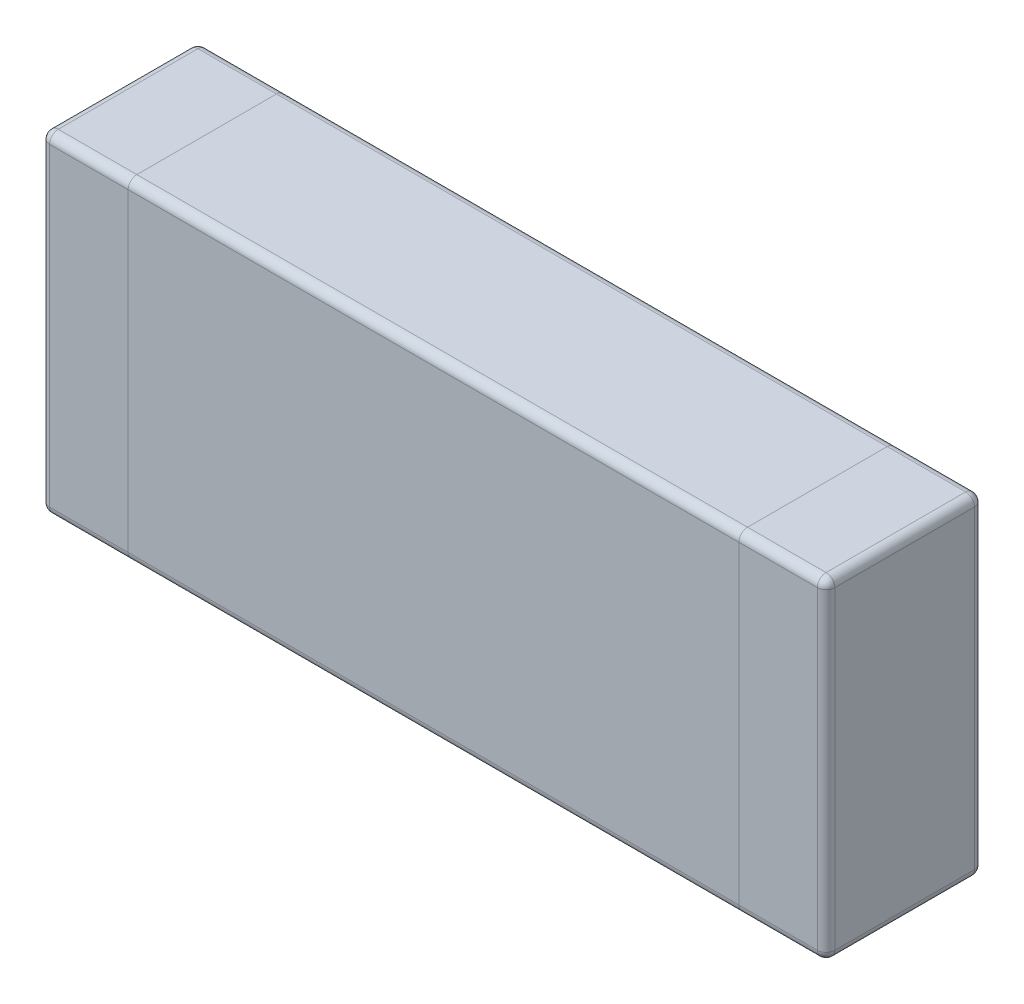
ISO-10303-21;
HEADER;
FILE_DESCRIPTION(('STEP AP214'),'2;1');
FILE_NAME('part.step','',(''),(''),'','','');
FILE_SCHEMA(('AUTOMOTIVE_DESIGN { 1 0 10303 214 1 1 1 1 }'));
ENDSEC;
DATA;
#1=APPLICATION_CONTEXT('core data for automotive mechanical design processes');
#2=APPLICATION_PROTOCOL_DEFINITION('international standard','automotive_design',2000,#1);
#3=PRODUCT_CONTEXT('',#1,'mechanical');
#4=PRODUCT('Part','Part','',(#3));
#5=PRODUCT_RELATED_PRODUCT_CATEGORY('part','',(#4));
#6=PRODUCT_DEFINITION_FORMATION('','',#4);
#7=PRODUCT_DEFINITION_CONTEXT('part definition',#1,'design');
#8=PRODUCT_DEFINITION('design','',#6,#7);
#9=PRODUCT_DEFINITION_SHAPE('','',#8);
#10=(LENGTH_UNIT() NAMED_UNIT(*) SI_UNIT(.MILLI.,.METRE.));
#11=(NAMED_UNIT(*) PLANE_ANGLE_UNIT() SI_UNIT($,.RADIAN.));
#12=(NAMED_UNIT(*) SI_UNIT($,.STERADIAN.) SOLID_ANGLE_UNIT());
#13=UNCERTAINTY_MEASURE_WITH_UNIT(LENGTH_MEASURE(1.E-05),#10,'distance_accuracy_value','');
#14=(GEOMETRIC_REPRESENTATION_CONTEXT(3) GLOBAL_UNCERTAINTY_ASSIGNED_CONTEXT((#13)) GLOBAL_UNIT_ASSIGNED_CONTEXT((#10,
#11,#12)) REPRESENTATION_CONTEXT('',''));
#15=CARTESIAN_POINT('',(0.,0.,0.));
#16=DIRECTION('',(0.,0.,1.));
#17=DIRECTION('',(1.,0.,0.));
#18=AXIS2_PLACEMENT_3D('',#15,#16,#17);
#19=CARTESIAN_POINT('',(2.25,1.9,-0.45));
#20=DIRECTION('',(0.,-1.,0.));
#21=DIRECTION('',(0.,0.,-1.));
#22=AXIS2_PLACEMENT_3D('',#19,#20,#21);
#23=PLANE('',#22);
#24=DIRECTION('',(0.,0.,1.));
#25=VECTOR('',#24,1.);
#26=CARTESIAN_POINT('',(-1.75,1.9,-0.450000000000002));
#27=LINE('',#26,#25);
#28=CARTESIAN_POINT('',(-1.75,1.9,-0.4));
#29=VERTEX_POINT('',#28);
#30=CARTESIAN_POINT('',(-1.75,1.9,0.4));
#31=VERTEX_POINT('',#30);
#32=EDGE_CURVE('E11',#29,#31,#27,.T.);
#33=ORIENTED_EDGE('',*,*,#32,.F.);
#34=DIRECTION('',(-1.,0.,0.));
#35=VECTOR('',#34,1.);
#36=CARTESIAN_POINT('',(2.25,1.9,-0.4));
#37=LINE('',#36,#35);
#38=CARTESIAN_POINT('',(-2.2,1.9,-0.4));
#39=VERTEX_POINT('',#38);
#40=EDGE_CURVE('E253',#29,#39,#37,.T.);
#41=ORIENTED_EDGE('',*,*,#40,.T.);
#42=DIRECTION('',(0.,0.,1.));
#43=VECTOR('',#42,1.);
#44=CARTESIAN_POINT('',(-2.2,1.9,-0.45));
#45=LINE('',#44,#43);
#46=CARTESIAN_POINT('',(-2.2,1.9,0.4));
#47=VERTEX_POINT('',#46);
#48=EDGE_CURVE('E256',#39,#47,#45,.T.);
#49=ORIENTED_EDGE('',*,*,#48,.T.);
#50=DIRECTION('',(1.,0.,0.));
#51=VECTOR('',#50,1.);
#52=CARTESIAN_POINT('',(2.25,1.9,0.4));
#53=LINE('',#52,#51);
#54=EDGE_CURVE('E260',#47,#31,#53,.T.);
#55=ORIENTED_EDGE('',*,*,#54,.T.);
#56=EDGE_LOOP('',(#33,#41,#49,#55));
#57=FACE_BOUND('',#56,.T.);
#58=ADVANCED_FACE('F37',(#57),#23,.F.);
#59=DIRECTION('',(0.,0.,-1.));
#60=VECTOR('',#59,1.);
#61=CARTESIAN_POINT('',(1.75,1.9,-0.45));
#62=LINE('',#61,#60);
#63=CARTESIAN_POINT('',(1.75,1.9,0.4));
#64=VERTEX_POINT('',#63);
#65=CARTESIAN_POINT('',(1.75,1.9,-0.4));
#66=VERTEX_POINT('',#65);
#67=EDGE_CURVE('E47',#64,#66,#62,.T.);
#68=ORIENTED_EDGE('',*,*,#67,.F.);
#69=CARTESIAN_POINT('',(2.2,1.9,0.4));
#70=VERTEX_POINT('',#69);
#71=EDGE_CURVE('E259',#64,#70,#53,.T.);
#72=ORIENTED_EDGE('',*,*,#71,.T.);
#73=DIRECTION('',(0.,0.,-1.));
#74=VECTOR('',#73,1.);
#75=CARTESIAN_POINT('',(2.2,1.9,-0.45));
#76=LINE('',#75,#74);
#77=CARTESIAN_POINT('',(2.2,1.9,-0.4));
#78=VERTEX_POINT('',#77);
#79=EDGE_CURVE('E250',#70,#78,#76,.T.);
#80=ORIENTED_EDGE('',*,*,#79,.T.);
#81=EDGE_CURVE('E254',#78,#66,#37,.T.);
#82=ORIENTED_EDGE('',*,*,#81,.T.);
#83=EDGE_LOOP('',(#68,#72,#80,#82));
#84=FACE_BOUND('',#83,.T.);
#85=ADVANCED_FACE('F526',(#84),#23,.F.);
#86=CARTESIAN_POINT('',(2.25,1.85,0.4));
#87=DIRECTION('',(1.,0.,0.));
#88=DIRECTION('',(0.,0.,-1.));
#89=AXIS2_PLACEMENT_3D('',#86,#87,#88);
#90=CYLINDRICAL_SURFACE('',#89,0.05);
#91=DIRECTION('',(1.,0.,0.));
#92=VECTOR('',#91,1.);
#93=CARTESIAN_POINT('',(-2.25,1.85,0.45));
#94=LINE('',#93,#92);
#95=CARTESIAN_POINT('',(-1.75,1.85,0.45));
#96=VERTEX_POINT('',#95);
#97=CARTESIAN_POINT('',(-2.2,1.85,0.45));
#98=VERTEX_POINT('',#97);
#99=EDGE_CURVE('E246',#96,#98,#94,.F.);
#100=ORIENTED_EDGE('',*,*,#99,.F.);
#101=CARTESIAN_POINT('',(-1.75,1.85,0.4));
#102=DIRECTION('',(1.,0.,0.));
#103=DIRECTION('',(0.,0.,-1.));
#104=AXIS2_PLACEMENT_3D('',#101,#102,#103);
#105=CIRCLE('',#104,0.05);
#106=EDGE_CURVE('E354',#96,#31,#105,.F.);
#107=ORIENTED_EDGE('',*,*,#106,.T.);
#108=ORIENTED_EDGE('',*,*,#54,.F.);
#109=CARTESIAN_POINT('',(-2.2,1.85,0.4));
#110=DIRECTION('',(-1.,0.,0.));
#111=DIRECTION('',(0.,-1.,0.));
#112=AXIS2_PLACEMENT_3D('',#109,#110,#111);
#113=CIRCLE('',#112,0.05);
#114=EDGE_CURVE('E330',#47,#98,#113,.F.);
#115=ORIENTED_EDGE('',*,*,#114,.T.);
#116=EDGE_LOOP('',(#100,#107,#108,#115));
#117=FACE_BOUND('',#116,.T.);
#118=ADVANCED_FACE('F483',(#117),#90,.T.);
#119=ORIENTED_EDGE('',*,*,#71,.F.);
#120=CARTESIAN_POINT('',(1.75,1.85,0.4));
#121=DIRECTION('',(-1.,0.,0.));
#122=DIRECTION('',(0.,0.,1.));
#123=AXIS2_PLACEMENT_3D('',#120,#121,#122);
#124=CIRCLE('',#123,0.05);
#125=CARTESIAN_POINT('',(1.75,1.85,0.45));
#126=VERTEX_POINT('',#125);
#127=EDGE_CURVE('E353',#64,#126,#124,.F.);
#128=ORIENTED_EDGE('',*,*,#127,.T.);
#129=CARTESIAN_POINT('',(2.2,1.85,0.45));
#130=VERTEX_POINT('',#129);
#131=EDGE_CURVE('E247',#130,#126,#94,.F.);
#132=ORIENTED_EDGE('',*,*,#131,.F.);
#133=CARTESIAN_POINT('',(2.2,1.85,0.4));
#134=DIRECTION('',(1.,0.,0.));
#135=DIRECTION('',(0.,0.,-1.));
#136=AXIS2_PLACEMENT_3D('',#133,#134,#135);
#137=CIRCLE('',#136,0.05);
#138=EDGE_CURVE('E315',#70,#130,#137,.T.);
#139=ORIENTED_EDGE('',*,*,#138,.F.);
#140=EDGE_LOOP('',(#119,#128,#132,#139));
#141=FACE_BOUND('',#140,.T.);
#142=ADVANCED_FACE('F457',(#141),#90,.T.);
#143=CARTESIAN_POINT('',(-2.25,1.9,0.45));
#144=DIRECTION('',(0.,0.,-1.));
#145=DIRECTION('',(-1.,0.,0.));
#146=AXIS2_PLACEMENT_3D('',#143,#144,#145);
#147=PLANE('',#146);
#148=DIRECTION('',(0.,-1.,0.));
#149=VECTOR('',#148,1.);
#150=CARTESIAN_POINT('',(-1.75,1.9,0.45));
#151=LINE('',#150,#149);
#152=CARTESIAN_POINT('',(-1.75,0.0499999999999999,0.45));
#153=VERTEX_POINT('',#152);
#154=EDGE_CURVE('E349',#96,#153,#151,.T.);
#155=ORIENTED_EDGE('',*,*,#154,.F.);
#156=ORIENTED_EDGE('',*,*,#99,.T.);
#157=DIRECTION('',(0.,-1.,0.));
#158=VECTOR('',#157,1.);
#159=CARTESIAN_POINT('',(-2.2,1.9,0.45));
#160=LINE('',#159,#158);
#161=CARTESIAN_POINT('',(-2.2,0.0499999999999999,0.45));
#162=VERTEX_POINT('',#161);
#163=EDGE_CURVE('E243',#98,#162,#160,.T.);
#164=ORIENTED_EDGE('',*,*,#163,.T.);
#165=DIRECTION('',(1.,0.,0.));
#166=VECTOR('',#165,1.);
#167=CARTESIAN_POINT('',(2.25,0.0499999999999999,0.45));
#168=LINE('',#167,#166);
#169=EDGE_CURVE('E237',#162,#153,#168,.T.);
#170=ORIENTED_EDGE('',*,*,#169,.T.);
#171=EDGE_LOOP('',(#155,#156,#164,#170));
#172=FACE_BOUND('',#171,.T.);
#173=ADVANCED_FACE('F471',(#172),#147,.F.);
#174=DIRECTION('',(0.,1.,0.));
#175=VECTOR('',#174,1.);
#176=CARTESIAN_POINT('',(1.75,1.9,0.45));
#177=LINE('',#176,#175);
#178=CARTESIAN_POINT('',(1.75,0.0499999999999999,0.45));
#179=VERTEX_POINT('',#178);
#180=EDGE_CURVE('E345',#179,#126,#177,.T.);
#181=ORIENTED_EDGE('',*,*,#180,.F.);
#182=CARTESIAN_POINT('',(2.2,0.0499999999999999,0.45));
#183=VERTEX_POINT('',#182);
#184=EDGE_CURVE('E236',#179,#183,#168,.T.);
#185=ORIENTED_EDGE('',*,*,#184,.T.);
#186=DIRECTION('',(0.,-1.,0.));
#187=VECTOR('',#186,1.);
#188=CARTESIAN_POINT('',(2.2,1.9,0.45));
#189=LINE('',#188,#187);
#190=EDGE_CURVE('E240',#183,#130,#189,.F.);
#191=ORIENTED_EDGE('',*,*,#190,.T.);
#192=ORIENTED_EDGE('',*,*,#131,.T.);
#193=EDGE_LOOP('',(#181,#185,#191,#192));
#194=FACE_BOUND('',#193,.T.);
#195=ADVANCED_FACE('F453',(#194),#147,.F.);
#196=CARTESIAN_POINT('',(-2.25,0.0499999999999999,0.4));
#197=DIRECTION('',(-1.,0.,0.));
#198=DIRECTION('',(0.,0.,1.));
#199=AXIS2_PLACEMENT_3D('',#196,#197,#198);
#200=CYLINDRICAL_SURFACE('',#199,0.05);
#201=DIRECTION('',(1.,0.,0.));
#202=VECTOR('',#201,1.);
#203=CARTESIAN_POINT('',(-2.25,0.,0.4));
#204=LINE('',#203,#202);
#205=CARTESIAN_POINT('',(-1.75,0.,0.4));
#206=VERTEX_POINT('',#205);
#207=CARTESIAN_POINT('',(-2.2,0.,0.4));
#208=VERTEX_POINT('',#207);
#209=EDGE_CURVE('E266',#206,#208,#204,.F.);
#210=ORIENTED_EDGE('',*,*,#209,.F.);
#211=CARTESIAN_POINT('',(-1.75,0.0499999999999999,0.4));
#212=DIRECTION('',(1.,0.,0.));
#213=DIRECTION('',(0.,0.,-1.));
#214=AXIS2_PLACEMENT_3D('',#211,#212,#213);
#215=CIRCLE('',#214,0.05);
#216=EDGE_CURVE('E350',#206,#153,#215,.F.);
#217=ORIENTED_EDGE('',*,*,#216,.T.);
#218=ORIENTED_EDGE('',*,*,#169,.F.);
#219=CARTESIAN_POINT('',(-2.2,0.05,0.4));
#220=DIRECTION('',(-1.,0.,0.));
#221=DIRECTION('',(0.,0.,1.));
#222=AXIS2_PLACEMENT_3D('',#219,#220,#221);
#223=CIRCLE('',#222,0.05);
#224=EDGE_CURVE('E321',#162,#208,#223,.F.);
#225=ORIENTED_EDGE('',*,*,#224,.T.);
#226=EDGE_LOOP('',(#210,#217,#218,#225));
#227=FACE_BOUND('',#226,.T.);
#228=ADVANCED_FACE('F509',(#227),#200,.T.);
#229=ORIENTED_EDGE('',*,*,#184,.F.);
#230=CARTESIAN_POINT('',(1.75,0.0499999999999999,0.4));
#231=DIRECTION('',(-1.,0.,0.));
#232=DIRECTION('',(0.,0.,1.));
#233=AXIS2_PLACEMENT_3D('',#230,#231,#232);
#234=CIRCLE('',#233,0.05);
#235=CARTESIAN_POINT('',(1.75,0.,0.4));
#236=VERTEX_POINT('',#235);
#237=EDGE_CURVE('E365',#179,#236,#234,.F.);
#238=ORIENTED_EDGE('',*,*,#237,.T.);
#239=CARTESIAN_POINT('',(2.2,0.,0.4));
#240=VERTEX_POINT('',#239);
#241=EDGE_CURVE('E267',#240,#236,#204,.F.);
#242=ORIENTED_EDGE('',*,*,#241,.F.);
#243=CARTESIAN_POINT('',(2.2,0.0499999999999999,0.4));
#244=DIRECTION('',(1.,0.,0.));
#245=DIRECTION('',(0.,0.,-1.));
#246=AXIS2_PLACEMENT_3D('',#243,#244,#245);
#247=CIRCLE('',#246,0.05);
#248=EDGE_CURVE('E301',#183,#240,#247,.T.);
#249=ORIENTED_EDGE('',*,*,#248,.F.);
#250=EDGE_LOOP('',(#229,#238,#242,#249));
#251=FACE_BOUND('',#250,.T.);
#252=ADVANCED_FACE('F443',(#251),#200,.T.);
#253=CARTESIAN_POINT('',(2.25,0.,-0.45));
#254=DIRECTION('',(0.,-1.,0.));
#255=DIRECTION('',(0.,0.,-1.));
#256=AXIS2_PLACEMENT_3D('',#253,#254,#255);
#257=PLANE('',#256);
#258=DIRECTION('',(-1.,0.,0.));
#259=VECTOR('',#258,1.);
#260=CARTESIAN_POINT('',(2.25,0.,-0.4));
#261=LINE('',#260,#259);
#262=CARTESIAN_POINT('',(-2.2,0.,-0.4));
#263=VERTEX_POINT('',#262);
#264=CARTESIAN_POINT('',(-1.75,0.,-0.4));
#265=VERTEX_POINT('',#264);
#266=EDGE_CURVE('E274',#263,#265,#261,.F.);
#267=ORIENTED_EDGE('',*,*,#266,.T.);
#268=DIRECTION('',(0.,0.,1.));
#269=VECTOR('',#268,1.);
#270=CARTESIAN_POINT('',(-1.75,0.,-0.450000000000002));
#271=LINE('',#270,#269);
#272=EDGE_CURVE('E366',#265,#206,#271,.T.);
#273=ORIENTED_EDGE('',*,*,#272,.T.);
#274=ORIENTED_EDGE('',*,*,#209,.T.);
#275=DIRECTION('',(0.,0.,1.));
#276=VECTOR('',#275,1.);
#277=CARTESIAN_POINT('',(-2.2,0.,-0.45));
#278=LINE('',#277,#276);
#279=EDGE_CURVE('E270',#208,#263,#278,.F.);
#280=ORIENTED_EDGE('',*,*,#279,.T.);
#281=EDGE_LOOP('',(#267,#273,#274,#280));
#282=FACE_BOUND('',#281,.T.);
#283=ADVANCED_FACE('F512',(#282),#257,.T.);
#284=ORIENTED_EDGE('',*,*,#241,.T.);
#285=DIRECTION('',(0.,0.,-1.));
#286=VECTOR('',#285,1.);
#287=CARTESIAN_POINT('',(1.75,0.,-0.45));
#288=LINE('',#287,#286);
#289=CARTESIAN_POINT('',(1.75,0.,-0.4));
#290=VERTEX_POINT('',#289);
#291=EDGE_CURVE('E360',#236,#290,#288,.T.);
#292=ORIENTED_EDGE('',*,*,#291,.T.);
#293=CARTESIAN_POINT('',(2.2,0.,-0.4));
#294=VERTEX_POINT('',#293);
#295=EDGE_CURVE('E273',#290,#294,#261,.F.);
#296=ORIENTED_EDGE('',*,*,#295,.T.);
#297=DIRECTION('',(0.,0.,-1.));
#298=VECTOR('',#297,1.);
#299=CARTESIAN_POINT('',(2.2,0.,0.45));
#300=LINE('',#299,#298);
#301=EDGE_CURVE('E263',#294,#240,#300,.F.);
#302=ORIENTED_EDGE('',*,*,#301,.T.);
#303=EDGE_LOOP('',(#284,#292,#296,#302));
#304=FACE_BOUND('',#303,.T.);
#305=ADVANCED_FACE('F387',(#304),#257,.T.);
#306=CARTESIAN_POINT('',(2.25,1.85,-0.4));
#307=DIRECTION('',(-1.,0.,0.));
#308=DIRECTION('',(0.,0.,1.));
#309=AXIS2_PLACEMENT_3D('',#306,#307,#308);
#310=CYLINDRICAL_SURFACE('',#309,0.05);
#311=ORIENTED_EDGE('',*,*,#40,.F.);
#312=CARTESIAN_POINT('',(-1.75,1.85,-0.4));
#313=DIRECTION('',(1.,0.,0.));
#314=DIRECTION('',(0.,0.,-1.));
#315=AXIS2_PLACEMENT_3D('',#312,#313,#314);
#316=CIRCLE('',#315,0.05);
#317=CARTESIAN_POINT('',(-1.75,1.85,-0.45));
#318=VERTEX_POINT('',#317);
#319=EDGE_CURVE('E357',#29,#318,#316,.F.);
#320=ORIENTED_EDGE('',*,*,#319,.T.);
#321=DIRECTION('',(-1.,0.,0.));
#322=VECTOR('',#321,1.);
#323=CARTESIAN_POINT('',(-2.25,1.85,-0.45));
#324=LINE('',#323,#322);
#325=CARTESIAN_POINT('',(-2.2,1.85,-0.45));
#326=VERTEX_POINT('',#325);
#327=EDGE_CURVE('E216',#326,#318,#324,.F.);
#328=ORIENTED_EDGE('',*,*,#327,.F.);
#329=CARTESIAN_POINT('',(-2.2,1.85,-0.4));
#330=DIRECTION('',(-1.,0.,0.));
#331=DIRECTION('',(0.,0.,1.));
#332=AXIS2_PLACEMENT_3D('',#329,#330,#331);
#333=CIRCLE('',#332,0.05);
#334=EDGE_CURVE('E292',#326,#39,#333,.F.);
#335=ORIENTED_EDGE('',*,*,#334,.T.);
#336=EDGE_LOOP('',(#311,#320,#328,#335));
#337=FACE_BOUND('',#336,.T.);
#338=ADVANCED_FACE('F519',(#337),#310,.T.);
#339=CARTESIAN_POINT('',(1.75,1.85,-0.45));
#340=VERTEX_POINT('',#339);
#341=CARTESIAN_POINT('',(2.2,1.85,-0.45));
#342=VERTEX_POINT('',#341);
#343=EDGE_CURVE('E211',#340,#342,#324,.F.);
#344=ORIENTED_EDGE('',*,*,#343,.F.);
#345=CARTESIAN_POINT('',(1.75,1.85,-0.4));
#346=DIRECTION('',(-1.,0.,0.));
#347=DIRECTION('',(0.,0.,1.));
#348=AXIS2_PLACEMENT_3D('',#345,#346,#347);
#349=CIRCLE('',#348,0.05);
#350=EDGE_CURVE('E361',#340,#66,#349,.F.);
#351=ORIENTED_EDGE('',*,*,#350,.T.);
#352=ORIENTED_EDGE('',*,*,#81,.F.);
#353=CARTESIAN_POINT('',(2.2,1.85,-0.4));
#354=DIRECTION('',(1.,0.,0.));
#355=DIRECTION('',(0.,1.,0.));
#356=AXIS2_PLACEMENT_3D('',#353,#354,#355);
#357=CIRCLE('',#356,0.05);
#358=EDGE_CURVE('E196',#342,#78,#357,.T.);
#359=ORIENTED_EDGE('',*,*,#358,.F.);
#360=EDGE_LOOP('',(#344,#351,#352,#359));
#361=FACE_BOUND('',#360,.T.);
#362=ADVANCED_FACE('F422',(#361),#310,.T.);
#363=CARTESIAN_POINT('',(-2.25,0.0499999999999999,-0.4));
#364=DIRECTION('',(1.,0.,0.));
#365=DIRECTION('',(0.,0.,-1.));
#366=AXIS2_PLACEMENT_3D('',#363,#364,#365);
#367=CYLINDRICAL_SURFACE('',#366,0.05);
#368=DIRECTION('',(-1.,0.,0.));
#369=VECTOR('',#368,1.);
#370=CARTESIAN_POINT('',(-2.25,0.0499999999999999,-0.45));
#371=LINE('',#370,#369);
#372=CARTESIAN_POINT('',(-1.75,0.0499999999999999,-0.45));
#373=VERTEX_POINT('',#372);
#374=CARTESIAN_POINT('',(-2.2,0.0499999999999999,-0.45));
#375=VERTEX_POINT('',#374);
#376=EDGE_CURVE('E208',#373,#375,#371,.T.);
#377=ORIENTED_EDGE('',*,*,#376,.F.);
#378=CARTESIAN_POINT('',(-1.75,0.0499999999999999,-0.4));
#379=DIRECTION('',(1.,0.,0.));
#380=DIRECTION('',(0.,0.,-1.));
#381=AXIS2_PLACEMENT_3D('',#378,#379,#380);
#382=CIRCLE('',#381,0.05);
#383=EDGE_CURVE('E370',#373,#265,#382,.F.);
#384=ORIENTED_EDGE('',*,*,#383,.T.);
#385=ORIENTED_EDGE('',*,*,#266,.F.);
#386=CARTESIAN_POINT('',(-2.2,0.0499999999999999,-0.4));
#387=DIRECTION('',(-1.,0.,0.));
#388=DIRECTION('',(0.,0.,1.));
#389=AXIS2_PLACEMENT_3D('',#386,#387,#388);
#390=CIRCLE('',#389,0.05);
#391=EDGE_CURVE('E289',#263,#375,#390,.F.);
#392=ORIENTED_EDGE('',*,*,#391,.T.);
#393=EDGE_LOOP('',(#377,#384,#385,#392));
#394=FACE_BOUND('',#393,.T.);
#395=ADVANCED_FACE('F405',(#394),#367,.T.);
#396=ORIENTED_EDGE('',*,*,#295,.F.);
#397=CARTESIAN_POINT('',(1.75,0.0499999999999999,-0.4));
#398=DIRECTION('',(-1.,0.,0.));
#399=DIRECTION('',(0.,0.,1.));
#400=AXIS2_PLACEMENT_3D('',#397,#398,#399);
#401=CIRCLE('',#400,0.05);
#402=CARTESIAN_POINT('',(1.75,0.0499999999999999,-0.45));
#403=VERTEX_POINT('',#402);
#404=EDGE_CURVE('E41',#290,#403,#401,.F.);
#405=ORIENTED_EDGE('',*,*,#404,.T.);
#406=CARTESIAN_POINT('',(2.2,0.0499999999999999,-0.45));
#407=VERTEX_POINT('',#406);
#408=EDGE_CURVE('E199',#407,#403,#371,.T.);
#409=ORIENTED_EDGE('',*,*,#408,.F.);
#410=CARTESIAN_POINT('',(2.2,0.05,-0.4));
#411=DIRECTION('',(1.,0.,0.));
#412=DIRECTION('',(0.,0.,-1.));
#413=AXIS2_PLACEMENT_3D('',#410,#411,#412);
#414=CIRCLE('',#413,0.05);
#415=EDGE_CURVE('E188',#294,#407,#414,.T.);
#416=ORIENTED_EDGE('',*,*,#415,.F.);
#417=EDGE_LOOP('',(#396,#405,#409,#416));
#418=FACE_BOUND('',#417,.T.);
#419=ADVANCED_FACE('F200',(#418),#367,.T.);
#420=CARTESIAN_POINT('',(-2.25,1.9,-0.45));
#421=DIRECTION('',(0.,0.,1.));
#422=DIRECTION('',(1.,0.,0.));
#423=AXIS2_PLACEMENT_3D('',#420,#421,#422);
#424=PLANE('',#423);
#425=DIRECTION('',(0.,1.,0.));
#426=VECTOR('',#425,1.);
#427=CARTESIAN_POINT('',(-1.75,1.9,-0.45));
#428=LINE('',#427,#426);
#429=EDGE_CURVE('E341',#373,#318,#428,.T.);
#430=ORIENTED_EDGE('',*,*,#429,.F.);
#431=ORIENTED_EDGE('',*,*,#376,.T.);
#432=DIRECTION('',(0.,-1.,0.));
#433=VECTOR('',#432,1.);
#434=CARTESIAN_POINT('',(-2.2,1.9,-0.45));
#435=LINE('',#434,#433);
#436=EDGE_CURVE('E205',#375,#326,#435,.F.);
#437=ORIENTED_EDGE('',*,*,#436,.T.);
#438=ORIENTED_EDGE('',*,*,#327,.T.);
#439=EDGE_LOOP('',(#430,#431,#437,#438));
#440=FACE_BOUND('',#439,.T.);
#441=ADVANCED_FACE('F408',(#440),#424,.F.);
#442=DIRECTION('',(0.,-1.,0.));
#443=VECTOR('',#442,1.);
#444=CARTESIAN_POINT('',(1.75,1.9,-0.45));
#445=LINE('',#444,#443);
#446=EDGE_CURVE('E276',#340,#403,#445,.T.);
#447=ORIENTED_EDGE('',*,*,#446,.F.);
#448=ORIENTED_EDGE('',*,*,#343,.T.);
#449=DIRECTION('',(0.,-1.,0.));
#450=VECTOR('',#449,1.);
#451=CARTESIAN_POINT('',(2.2,1.9,-0.45));
#452=LINE('',#451,#450);
#453=EDGE_CURVE('E180',#342,#407,#452,.T.);
#454=ORIENTED_EDGE('',*,*,#453,.T.);
#455=ORIENTED_EDGE('',*,*,#408,.T.);
#456=EDGE_LOOP('',(#447,#448,#454,#455));
#457=FACE_BOUND('',#456,.T.);
#458=ADVANCED_FACE('F209',(#457),#424,.F.);
#459=CARTESIAN_POINT('',(2.25,1.9,0.45));
#460=DIRECTION('',(-1.,0.,0.));
#461=DIRECTION('',(0.,0.,1.));
#462=AXIS2_PLACEMENT_3D('',#459,#460,#461);
#463=PLANE('',#462);
#464=DIRECTION('',(0.,-1.,0.));
#465=VECTOR('',#464,1.);
#466=CARTESIAN_POINT('',(2.25,1.9,-0.4));
#467=LINE('',#466,#465);
#468=CARTESIAN_POINT('',(2.25,0.0499999999999999,-0.4));
#469=VERTEX_POINT('',#468);
#470=CARTESIAN_POINT('',(2.25,1.85,-0.4));
#471=VERTEX_POINT('',#470);
#472=EDGE_CURVE('E182',#469,#471,#467,.F.);
#473=ORIENTED_EDGE('',*,*,#472,.T.);
#474=DIRECTION('',(0.,0.,-1.));
#475=VECTOR('',#474,1.);
#476=CARTESIAN_POINT('',(2.25,1.85,0.45));
#477=LINE('',#476,#475);
#478=CARTESIAN_POINT('',(2.25,1.85,0.4));
#479=VERTEX_POINT('',#478);
#480=EDGE_CURVE('E225',#471,#479,#477,.F.);
#481=ORIENTED_EDGE('',*,*,#480,.T.);
#482=DIRECTION('',(0.,-1.,0.));
#483=VECTOR('',#482,1.);
#484=CARTESIAN_POINT('',(2.25,1.9,0.4));
#485=LINE('',#484,#483);
#486=CARTESIAN_POINT('',(2.25,0.0499999999999999,0.4));
#487=VERTEX_POINT('',#486);
#488=EDGE_CURVE('E222',#479,#487,#485,.T.);
#489=ORIENTED_EDGE('',*,*,#488,.T.);
#490=DIRECTION('',(0.,0.,-1.));
#491=VECTOR('',#490,1.);
#492=CARTESIAN_POINT('',(2.25,0.0499999999999999,-0.45));
#493=LINE('',#492,#491);
#494=EDGE_CURVE('E220',#487,#469,#493,.T.);
#495=ORIENTED_EDGE('',*,*,#494,.T.);
#496=EDGE_LOOP('',(#473,#481,#489,#495));
#497=FACE_BOUND('',#496,.T.);
#498=ADVANCED_FACE('F434',(#497),#463,.F.);
#499=EDGE_CURVE('E206',#403,#373,#371,.T.);
#500=ORIENTED_EDGE('',*,*,#499,.T.);
#501=ORIENTED_EDGE('',*,*,#429,.T.);
#502=EDGE_CURVE('E214',#318,#340,#324,.F.);
#503=ORIENTED_EDGE('',*,*,#502,.T.);
#504=ORIENTED_EDGE('',*,*,#446,.T.);
#505=EDGE_LOOP('',(#500,#501,#503,#504));
#506=FACE_BOUND('',#505,.T.);
#507=ADVANCED_FACE('F414',(#506),#424,.F.);
#508=CARTESIAN_POINT('',(-2.25,1.9,0.45));
#509=DIRECTION('',(1.,0.,0.));
#510=DIRECTION('',(0.,0.,-1.));
#511=AXIS2_PLACEMENT_3D('',#508,#509,#510);
#512=PLANE('',#511);
#513=DIRECTION('',(0.,-1.,0.));
#514=VECTOR('',#513,1.);
#515=CARTESIAN_POINT('',(-2.25,1.9,0.4));
#516=LINE('',#515,#514);
#517=CARTESIAN_POINT('',(-2.25,0.0499999999999999,0.4));
#518=VERTEX_POINT('',#517);
#519=CARTESIAN_POINT('',(-2.25,1.85,0.4));
#520=VERTEX_POINT('',#519);
#521=EDGE_CURVE('E229',#518,#520,#516,.F.);
#522=ORIENTED_EDGE('',*,*,#521,.T.);
#523=DIRECTION('',(0.,0.,1.));
#524=VECTOR('',#523,1.);
#525=CARTESIAN_POINT('',(-2.25,1.85,0.45));
#526=LINE('',#525,#524);
#527=CARTESIAN_POINT('',(-2.25,1.85,-0.4));
#528=VERTEX_POINT('',#527);
#529=EDGE_CURVE('E234',#520,#528,#526,.F.);
#530=ORIENTED_EDGE('',*,*,#529,.T.);
#531=DIRECTION('',(0.,-1.,0.));
#532=VECTOR('',#531,1.);
#533=CARTESIAN_POINT('',(-2.25,1.9,-0.4));
#534=LINE('',#533,#532);
#535=CARTESIAN_POINT('',(-2.25,0.0499999999999999,-0.4));
#536=VERTEX_POINT('',#535);
#537=EDGE_CURVE('E231',#528,#536,#534,.T.);
#538=ORIENTED_EDGE('',*,*,#537,.T.);
#539=DIRECTION('',(0.,0.,1.));
#540=VECTOR('',#539,1.);
#541=CARTESIAN_POINT('',(-2.25,0.0499999999999999,0.45));
#542=LINE('',#541,#540);
#543=EDGE_CURVE('E227',#536,#518,#542,.T.);
#544=ORIENTED_EDGE('',*,*,#543,.T.);
#545=EDGE_LOOP('',(#522,#530,#538,#544));
#546=FACE_BOUND('',#545,.T.);
#547=ADVANCED_FACE('F491',(#546),#512,.F.);
#548=EDGE_CURVE('E251',#126,#96,#94,.F.);
#549=ORIENTED_EDGE('',*,*,#548,.T.);
#550=ORIENTED_EDGE('',*,*,#154,.T.);
#551=EDGE_CURVE('E241',#153,#179,#168,.T.);
#552=ORIENTED_EDGE('',*,*,#551,.T.);
#553=ORIENTED_EDGE('',*,*,#180,.T.);
#554=EDGE_LOOP('',(#549,#550,#552,#553));
#555=FACE_BOUND('',#554,.T.);
#556=ADVANCED_FACE('F464',(#555),#147,.F.);
#557=EDGE_CURVE('E257',#66,#29,#37,.T.);
#558=ORIENTED_EDGE('',*,*,#557,.T.);
#559=ORIENTED_EDGE('',*,*,#32,.T.);
#560=EDGE_CURVE('E264',#31,#64,#53,.T.);
#561=ORIENTED_EDGE('',*,*,#560,.T.);
#562=ORIENTED_EDGE('',*,*,#67,.T.);
#563=EDGE_LOOP('',(#558,#559,#561,#562));
#564=FACE_BOUND('',#563,.T.);
#565=ADVANCED_FACE('F524',(#564),#23,.F.);
#566=ORIENTED_EDGE('',*,*,#272,.F.);
#567=EDGE_CURVE('E277',#265,#290,#261,.F.);
#568=ORIENTED_EDGE('',*,*,#567,.T.);
#569=ORIENTED_EDGE('',*,*,#291,.F.);
#570=EDGE_CURVE('E271',#236,#206,#204,.F.);
#571=ORIENTED_EDGE('',*,*,#570,.T.);
#572=EDGE_LOOP('',(#566,#568,#569,#571));
#573=FACE_BOUND('',#572,.T.);
#574=ADVANCED_FACE('F399',(#573),#257,.T.);
#575=CARTESIAN_POINT('',(-2.2,1.9,0.4));
#576=DIRECTION('',(0.,-1.,0.));
#577=DIRECTION('',(0.,0.,-1.));
#578=AXIS2_PLACEMENT_3D('',#575,#576,#577);
#579=CYLINDRICAL_SURFACE('',#578,0.05);
#580=CARTESIAN_POINT('',(-2.2,1.85,0.4));
#581=DIRECTION('',(0.,1.,0.));
#582=DIRECTION('',(0.,0.,1.));
#583=AXIS2_PLACEMENT_3D('',#580,#581,#582);
#584=CIRCLE('',#583,0.05);
#585=EDGE_CURVE('E336',#520,#98,#584,.T.);
#586=ORIENTED_EDGE('',*,*,#585,.F.);
#587=ORIENTED_EDGE('',*,*,#521,.F.);
#588=CARTESIAN_POINT('',(-2.2,0.0499999999999999,0.4));
#589=DIRECTION('',(0.,-1.,0.));
#590=DIRECTION('',(0.,0.,-1.));
#591=AXIS2_PLACEMENT_3D('',#588,#589,#590);
#592=CIRCLE('',#591,0.05);
#593=EDGE_CURVE('E333',#162,#518,#592,.T.);
#594=ORIENTED_EDGE('',*,*,#593,.F.);
#595=ORIENTED_EDGE('',*,*,#163,.F.);
#596=EDGE_LOOP('',(#586,#587,#594,#595));
#597=FACE_BOUND('',#596,.T.);
#598=ADVANCED_FACE('F39',(#597),#579,.T.);
#599=CARTESIAN_POINT('',(-2.2,1.85,0.4));
#600=DIRECTION('',(0.,0.,1.));
#601=DIRECTION('',(1.,0.,0.));
#602=AXIS2_PLACEMENT_3D('',#599,#600,#601);
#603=SPHERICAL_SURFACE('',#602,0.05);
#604=CARTESIAN_POINT('',(-2.2,1.85,0.4));
#605=DIRECTION('',(0.,0.,1.));
#606=DIRECTION('',(1.,0.,0.));
#607=AXIS2_PLACEMENT_3D('',#604,#605,#606);
#608=CIRCLE('',#607,0.05);
#609=EDGE_CURVE('E327',#520,#47,#608,.F.);
#610=ORIENTED_EDGE('',*,*,#609,.F.);
#611=ORIENTED_EDGE('',*,*,#585,.T.);
#612=ORIENTED_EDGE('',*,*,#114,.F.);
#613=EDGE_LOOP('',(#610,#611,#612));
#614=FACE_BOUND('',#613,.T.);
#615=ADVANCED_FACE('F480',(#614),#603,.T.);
#616=CARTESIAN_POINT('',(-2.2,0.05,0.4));
#617=DIRECTION('',(0.,0.,1.));
#618=DIRECTION('',(1.,0.,0.));
#619=AXIS2_PLACEMENT_3D('',#616,#617,#618);
#620=SPHERICAL_SURFACE('',#619,0.05);
#621=ORIENTED_EDGE('',*,*,#224,.F.);
#622=ORIENTED_EDGE('',*,*,#593,.T.);
#623=CARTESIAN_POINT('',(-2.2,0.0499999999999999,0.4));
#624=DIRECTION('',(0.,0.,1.));
#625=DIRECTION('',(1.,0.,0.));
#626=AXIS2_PLACEMENT_3D('',#623,#624,#625);
#627=CIRCLE('',#626,0.05);
#628=EDGE_CURVE('E324',#208,#518,#627,.F.);
#629=ORIENTED_EDGE('',*,*,#628,.F.);
#630=EDGE_LOOP('',(#621,#622,#629));
#631=FACE_BOUND('',#630,.T.);
#632=ADVANCED_FACE('F507',(#631),#620,.T.);
#633=ORIENTED_EDGE('',*,*,#106,.F.);
#634=ORIENTED_EDGE('',*,*,#548,.F.);
#635=ORIENTED_EDGE('',*,*,#127,.F.);
#636=ORIENTED_EDGE('',*,*,#560,.F.);
#637=EDGE_LOOP('',(#633,#634,#635,#636));
#638=FACE_BOUND('',#637,.T.);
#639=ADVANCED_FACE('F466',(#638),#90,.T.);
#640=CARTESIAN_POINT('',(-2.2,1.85,-0.45));
#641=DIRECTION('',(0.,0.,1.));
#642=DIRECTION('',(1.,0.,0.));
#643=AXIS2_PLACEMENT_3D('',#640,#641,#642);
#644=CYLINDRICAL_SURFACE('',#643,0.05);
#645=ORIENTED_EDGE('',*,*,#609,.T.);
#646=ORIENTED_EDGE('',*,*,#48,.F.);
#647=CARTESIAN_POINT('',(-2.2,1.85,-0.4));
#648=DIRECTION('',(0.,0.,-1.));
#649=DIRECTION('',(-1.,0.,0.));
#650=AXIS2_PLACEMENT_3D('',#647,#648,#649);
#651=CIRCLE('',#650,0.05);
#652=EDGE_CURVE('E312',#528,#39,#651,.T.);
#653=ORIENTED_EDGE('',*,*,#652,.F.);
#654=ORIENTED_EDGE('',*,*,#529,.F.);
#655=EDGE_LOOP('',(#645,#646,#653,#654));
#656=FACE_BOUND('',#655,.T.);
#657=ADVANCED_FACE('F488',(#656),#644,.T.);
#658=CARTESIAN_POINT('',(-2.2,1.9,-0.4));
#659=DIRECTION('',(0.,-1.,0.));
#660=DIRECTION('',(0.,0.,-1.));
#661=AXIS2_PLACEMENT_3D('',#658,#659,#660);
#662=CYLINDRICAL_SURFACE('',#661,0.05);
#663=CARTESIAN_POINT('',(-2.2,0.0499999999999999,-0.4));
#664=DIRECTION('',(0.,-1.,0.));
#665=DIRECTION('',(0.,0.,-1.));
#666=AXIS2_PLACEMENT_3D('',#663,#664,#665);
#667=CIRCLE('',#666,0.05);
#668=EDGE_CURVE('E306',#536,#375,#667,.T.);
#669=ORIENTED_EDGE('',*,*,#668,.F.);
#670=ORIENTED_EDGE('',*,*,#537,.F.);
#671=CARTESIAN_POINT('',(-2.2,1.85,-0.4));
#672=DIRECTION('',(0.,1.,0.));
#673=DIRECTION('',(0.,0.,1.));
#674=AXIS2_PLACEMENT_3D('',#671,#672,#673);
#675=CIRCLE('',#674,0.05);
#676=EDGE_CURVE('E309',#326,#528,#675,.T.);
#677=ORIENTED_EDGE('',*,*,#676,.F.);
#678=ORIENTED_EDGE('',*,*,#436,.F.);
#679=EDGE_LOOP('',(#669,#670,#677,#678));
#680=FACE_BOUND('',#679,.T.);
#681=ADVANCED_FACE('F495',(#680),#662,.T.);
#682=CARTESIAN_POINT('',(-2.2,0.0499999999999999,0.45));
#683=DIRECTION('',(0.,0.,-1.));
#684=DIRECTION('',(-1.,0.,0.));
#685=AXIS2_PLACEMENT_3D('',#682,#683,#684);
#686=CYLINDRICAL_SURFACE('',#685,0.05);
#687=ORIENTED_EDGE('',*,*,#628,.T.);
#688=ORIENTED_EDGE('',*,*,#543,.F.);
#689=CARTESIAN_POINT('',(-2.2,0.05,-0.4));
#690=DIRECTION('',(0.,0.,-1.));
#691=DIRECTION('',(-1.,0.,0.));
#692=AXIS2_PLACEMENT_3D('',#689,#690,#691);
#693=CIRCLE('',#692,0.05);
#694=EDGE_CURVE('E304',#263,#536,#693,.T.);
#695=ORIENTED_EDGE('',*,*,#694,.F.);
#696=ORIENTED_EDGE('',*,*,#279,.F.);
#697=EDGE_LOOP('',(#687,#688,#695,#696));
#698=FACE_BOUND('',#697,.T.);
#699=ADVANCED_FACE('F502',(#698),#686,.T.);
#700=ORIENTED_EDGE('',*,*,#216,.F.);
#701=ORIENTED_EDGE('',*,*,#570,.F.);
#702=ORIENTED_EDGE('',*,*,#237,.F.);
#703=ORIENTED_EDGE('',*,*,#551,.F.);
#704=EDGE_LOOP('',(#700,#701,#702,#703));
#705=FACE_BOUND('',#704,.T.);
#706=ADVANCED_FACE('F511',(#705),#200,.T.);
#707=CARTESIAN_POINT('',(2.2,1.9,0.4));
#708=DIRECTION('',(0.,-1.,0.));
#709=DIRECTION('',(0.,0.,-1.));
#710=AXIS2_PLACEMENT_3D('',#707,#708,#709);
#711=CYLINDRICAL_SURFACE('',#710,0.05);
#712=CARTESIAN_POINT('',(2.2,1.85,0.4));
#713=DIRECTION('',(0.,1.,0.));
#714=DIRECTION('',(0.,0.,1.));
#715=AXIS2_PLACEMENT_3D('',#712,#713,#714);
#716=CIRCLE('',#715,0.05);
#717=EDGE_CURVE('E318',#130,#479,#716,.T.);
#718=ORIENTED_EDGE('',*,*,#717,.F.);
#719=ORIENTED_EDGE('',*,*,#190,.F.);
#720=CARTESIAN_POINT('',(2.2,0.0499999999999999,0.4));
#721=DIRECTION('',(0.,-1.,0.));
#722=DIRECTION('',(0.,0.,-1.));
#723=AXIS2_PLACEMENT_3D('',#720,#721,#722);
#724=CIRCLE('',#723,0.05);
#725=EDGE_CURVE('E298',#487,#183,#724,.T.);
#726=ORIENTED_EDGE('',*,*,#725,.F.);
#727=ORIENTED_EDGE('',*,*,#488,.F.);
#728=EDGE_LOOP('',(#718,#719,#726,#727));
#729=FACE_BOUND('',#728,.T.);
#730=ADVANCED_FACE('F450',(#729),#711,.T.);
#731=CARTESIAN_POINT('',(2.2,1.85,0.4));
#732=DIRECTION('',(0.,0.,1.));
#733=DIRECTION('',(1.,0.,0.));
#734=AXIS2_PLACEMENT_3D('',#731,#732,#733);
#735=SPHERICAL_SURFACE('',#734,0.05);
#736=ORIENTED_EDGE('',*,*,#138,.T.);
#737=ORIENTED_EDGE('',*,*,#717,.T.);
#738=CARTESIAN_POINT('',(2.2,1.85,0.4));
#739=DIRECTION('',(0.,0.,1.));
#740=DIRECTION('',(1.,0.,0.));
#741=AXIS2_PLACEMENT_3D('',#738,#739,#740);
#742=CIRCLE('',#741,0.05);
#743=EDGE_CURVE('E295',#70,#479,#742,.F.);
#744=ORIENTED_EDGE('',*,*,#743,.F.);
#745=EDGE_LOOP('',(#736,#737,#744));
#746=FACE_BOUND('',#745,.T.);
#747=ADVANCED_FACE('F535',(#746),#735,.T.);
#748=CARTESIAN_POINT('',(-2.2,1.85,-0.4));
#749=DIRECTION('',(0.,0.,1.));
#750=DIRECTION('',(1.,0.,0.));
#751=AXIS2_PLACEMENT_3D('',#748,#749,#750);
#752=SPHERICAL_SURFACE('',#751,0.05);
#753=ORIENTED_EDGE('',*,*,#676,.T.);
#754=ORIENTED_EDGE('',*,*,#652,.T.);
#755=ORIENTED_EDGE('',*,*,#334,.F.);
#756=EDGE_LOOP('',(#753,#754,#755));
#757=FACE_BOUND('',#756,.T.);
#758=ADVANCED_FACE('F537',(#757),#752,.T.);
#759=CARTESIAN_POINT('',(-2.2,0.05,-0.4));
#760=DIRECTION('',(0.,0.,1.));
#761=DIRECTION('',(1.,0.,0.));
#762=AXIS2_PLACEMENT_3D('',#759,#760,#761);
#763=SPHERICAL_SURFACE('',#762,0.05);
#764=ORIENTED_EDGE('',*,*,#694,.T.);
#765=ORIENTED_EDGE('',*,*,#668,.T.);
#766=ORIENTED_EDGE('',*,*,#391,.F.);
#767=EDGE_LOOP('',(#764,#765,#766));
#768=FACE_BOUND('',#767,.T.);
#769=ADVANCED_FACE('F543',(#768),#763,.T.);
#770=CARTESIAN_POINT('',(2.2,0.05,0.4));
#771=DIRECTION('',(0.,0.,1.));
#772=DIRECTION('',(1.,0.,0.));
#773=AXIS2_PLACEMENT_3D('',#770,#771,#772);
#774=SPHERICAL_SURFACE('',#773,0.05);
#775=ORIENTED_EDGE('',*,*,#725,.T.);
#776=ORIENTED_EDGE('',*,*,#248,.T.);
#777=CARTESIAN_POINT('',(2.2,0.05,0.4));
#778=DIRECTION('',(0.,0.,1.));
#779=DIRECTION('',(1.,0.,0.));
#780=AXIS2_PLACEMENT_3D('',#777,#778,#779);
#781=CIRCLE('',#780,0.05);
#782=EDGE_CURVE('E286',#487,#240,#781,.F.);
#783=ORIENTED_EDGE('',*,*,#782,.F.);
#784=EDGE_LOOP('',(#775,#776,#783));
#785=FACE_BOUND('',#784,.T.);
#786=ADVANCED_FACE('F446',(#785),#774,.T.);
#787=CARTESIAN_POINT('',(2.2,1.85,-0.45));
#788=DIRECTION('',(0.,0.,-1.));
#789=DIRECTION('',(-1.,0.,0.));
#790=AXIS2_PLACEMENT_3D('',#787,#788,#789);
#791=CYLINDRICAL_SURFACE('',#790,0.05);
#792=ORIENTED_EDGE('',*,*,#743,.T.);
#793=ORIENTED_EDGE('',*,*,#480,.F.);
#794=CARTESIAN_POINT('',(2.2,1.85,-0.4));
#795=DIRECTION('',(0.,0.,-1.));
#796=DIRECTION('',(-1.,0.,0.));
#797=AXIS2_PLACEMENT_3D('',#794,#795,#796);
#798=CIRCLE('',#797,0.05);
#799=EDGE_CURVE('E283',#78,#471,#798,.T.);
#800=ORIENTED_EDGE('',*,*,#799,.F.);
#801=ORIENTED_EDGE('',*,*,#79,.F.);
#802=EDGE_LOOP('',(#792,#793,#800,#801));
#803=FACE_BOUND('',#802,.T.);
#804=ADVANCED_FACE('F430',(#803),#791,.T.);
#805=ORIENTED_EDGE('',*,*,#319,.F.);
#806=ORIENTED_EDGE('',*,*,#557,.F.);
#807=ORIENTED_EDGE('',*,*,#350,.F.);
#808=ORIENTED_EDGE('',*,*,#502,.F.);
#809=EDGE_LOOP('',(#805,#806,#807,#808));
#810=FACE_BOUND('',#809,.T.);
#811=ADVANCED_FACE('F417',(#810),#310,.T.);
#812=ORIENTED_EDGE('',*,*,#383,.F.);
#813=ORIENTED_EDGE('',*,*,#499,.F.);
#814=ORIENTED_EDGE('',*,*,#404,.F.);
#815=ORIENTED_EDGE('',*,*,#567,.F.);
#816=EDGE_LOOP('',(#812,#813,#814,#815));
#817=FACE_BOUND('',#816,.T.);
#818=ADVANCED_FACE('F396',(#817),#367,.T.);
#819=CARTESIAN_POINT('',(2.2,0.0499999999999999,0.45));
#820=DIRECTION('',(0.,0.,1.));
#821=DIRECTION('',(1.,0.,0.));
#822=AXIS2_PLACEMENT_3D('',#819,#820,#821);
#823=CYLINDRICAL_SURFACE('',#822,0.05);
#824=ORIENTED_EDGE('',*,*,#782,.T.);
#825=ORIENTED_EDGE('',*,*,#301,.F.);
#826=CARTESIAN_POINT('',(2.2,0.0499999999999999,-0.4));
#827=DIRECTION('',(0.,0.,-1.));
#828=DIRECTION('',(-1.,0.,0.));
#829=AXIS2_PLACEMENT_3D('',#826,#827,#828);
#830=CIRCLE('',#829,0.05);
#831=EDGE_CURVE('E192',#469,#294,#830,.T.);
#832=ORIENTED_EDGE('',*,*,#831,.F.);
#833=ORIENTED_EDGE('',*,*,#494,.F.);
#834=EDGE_LOOP('',(#824,#825,#832,#833));
#835=FACE_BOUND('',#834,.T.);
#836=ADVANCED_FACE('F438',(#835),#823,.T.);
#837=CARTESIAN_POINT('',(2.2,1.85,-0.4));
#838=DIRECTION('',(0.,0.,1.));
#839=DIRECTION('',(1.,0.,0.));
#840=AXIS2_PLACEMENT_3D('',#837,#838,#839);
#841=SPHERICAL_SURFACE('',#840,0.05);
#842=ORIENTED_EDGE('',*,*,#358,.T.);
#843=ORIENTED_EDGE('',*,*,#799,.T.);
#844=CARTESIAN_POINT('',(2.2,1.85,-0.4));
#845=DIRECTION('',(0.,1.,0.));
#846=DIRECTION('',(0.,0.,1.));
#847=AXIS2_PLACEMENT_3D('',#844,#845,#846);
#848=CIRCLE('',#847,0.05);
#849=EDGE_CURVE('E185',#342,#471,#848,.F.);
#850=ORIENTED_EDGE('',*,*,#849,.F.);
#851=EDGE_LOOP('',(#842,#843,#850));
#852=FACE_BOUND('',#851,.T.);
#853=ADVANCED_FACE('F426',(#852),#841,.T.);
#854=CARTESIAN_POINT('',(2.2,0.05,-0.4));
#855=DIRECTION('',(0.,0.,1.));
#856=DIRECTION('',(1.,0.,0.));
#857=AXIS2_PLACEMENT_3D('',#854,#855,#856);
#858=SPHERICAL_SURFACE('',#857,0.05);
#859=ORIENTED_EDGE('',*,*,#831,.T.);
#860=ORIENTED_EDGE('',*,*,#415,.T.);
#861=CARTESIAN_POINT('',(2.2,0.0499999999999999,-0.4));
#862=DIRECTION('',(0.,-1.,0.));
#863=DIRECTION('',(0.,0.,-1.));
#864=AXIS2_PLACEMENT_3D('',#861,#862,#863);
#865=CIRCLE('',#864,0.05);
#866=EDGE_CURVE('E176',#469,#407,#865,.F.);
#867=ORIENTED_EDGE('',*,*,#866,.F.);
#868=EDGE_LOOP('',(#859,#860,#867));
#869=FACE_BOUND('',#868,.T.);
#870=ADVANCED_FACE('F190',(#869),#858,.T.);
#871=CARTESIAN_POINT('',(2.2,1.9,-0.4));
#872=DIRECTION('',(0.,-1.,0.));
#873=DIRECTION('',(0.,0.,-1.));
#874=AXIS2_PLACEMENT_3D('',#871,#872,#873);
#875=CYLINDRICAL_SURFACE('',#874,0.05);
#876=ORIENTED_EDGE('',*,*,#849,.T.);
#877=ORIENTED_EDGE('',*,*,#472,.F.);
#878=ORIENTED_EDGE('',*,*,#866,.T.);
#879=ORIENTED_EDGE('',*,*,#453,.F.);
#880=EDGE_LOOP('',(#876,#877,#878,#879));
#881=FACE_BOUND('',#880,.T.);
#882=ADVANCED_FACE('F178',(#881),#875,.T.);
#883=CLOSED_SHELL('',(#58,#85,#118,#142,#173,#195,#228,#252,#283,#305,#338,#362,#395,#419,#441,
#458,#498,#507,#547,#556,#565,#574,#598,#615,#632,#639,#657,#681,#699,#706,#730,#747,#758,#769,
#786,#804,#811,#818,#836,#853,#870,#882));
#884=MANIFOLD_SOLID_BREP('B2',#883);
#885=ADVANCED_BREP_SHAPE_REPRESENTATION('',(#18,#884),#14);
#886=SHAPE_DEFINITION_REPRESENTATION(#9,#885);
ENDSEC;
END-ISO-10303-21;
